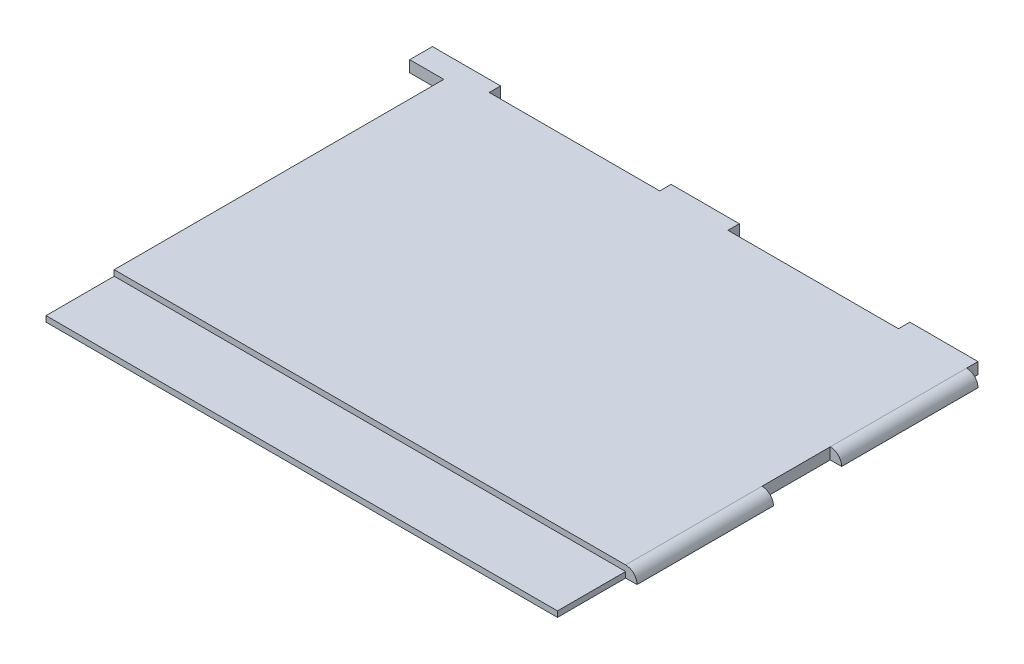
ISO-10303-21;
HEADER;
FILE_DESCRIPTION(('STEP AP214'),'2;1');
FILE_NAME('part.step','',(''),(''),'','','');
FILE_SCHEMA(('AUTOMOTIVE_DESIGN { 1 0 10303 214 1 1 1 1 }'));
ENDSEC;
DATA;
#1=APPLICATION_CONTEXT('core data for automotive mechanical design processes');
#2=APPLICATION_PROTOCOL_DEFINITION('international standard','automotive_design',2000,#1);
#3=PRODUCT_CONTEXT('',#1,'mechanical');
#4=PRODUCT('Part','Part','',(#3));
#5=PRODUCT_RELATED_PRODUCT_CATEGORY('part','',(#4));
#6=PRODUCT_DEFINITION_FORMATION('','',#4);
#7=PRODUCT_DEFINITION_CONTEXT('part definition',#1,'design');
#8=PRODUCT_DEFINITION('design','',#6,#7);
#9=PRODUCT_DEFINITION_SHAPE('','',#8);
#10=(LENGTH_UNIT() NAMED_UNIT(*) SI_UNIT(.MILLI.,.METRE.));
#11=(NAMED_UNIT(*) PLANE_ANGLE_UNIT() SI_UNIT($,.RADIAN.));
#12=(NAMED_UNIT(*) SI_UNIT($,.STERADIAN.) SOLID_ANGLE_UNIT());
#13=UNCERTAINTY_MEASURE_WITH_UNIT(LENGTH_MEASURE(1.E-05),#10,'distance_accuracy_value','');
#14=(GEOMETRIC_REPRESENTATION_CONTEXT(3) GLOBAL_UNCERTAINTY_ASSIGNED_CONTEXT((#13)) GLOBAL_UNIT_ASSIGNED_CONTEXT((#10,
#11,#12)) REPRESENTATION_CONTEXT('',''));
#15=CARTESIAN_POINT('',(0.,0.,0.));
#16=DIRECTION('',(0.,0.,1.));
#17=DIRECTION('',(1.,0.,0.));
#18=AXIS2_PLACEMENT_3D('',#15,#16,#17);
#19=CARTESIAN_POINT('',(203.746286717569,5.,0.));
#20=DIRECTION('',(1.,0.,0.));
#21=DIRECTION('',(0.,0.,-1.));
#22=AXIS2_PLACEMENT_3D('',#19,#20,#21);
#23=PLANE('',#22);
#24=DIRECTION('',(0.,0.,-1.));
#25=VECTOR('',#24,1.);
#26=CARTESIAN_POINT('',(203.746286717569,2.5,136.464902660625));
#27=LINE('',#26,#25);
#28=CARTESIAN_POINT('',(203.746286717569,2.5,136.464902660625));
#29=VERTEX_POINT('',#28);
#30=CARTESIAN_POINT('',(203.746286717569,2.5,106.464902660625));
#31=VERTEX_POINT('',#30);
#32=EDGE_CURVE('E596',#29,#31,#27,.T.);
#33=ORIENTED_EDGE('',*,*,#32,.F.);
#34=DIRECTION('',(0.,-1.,0.));
#35=VECTOR('',#34,1.);
#36=CARTESIAN_POINT('',(203.746286717569,5.,136.464902660625));
#37=LINE('',#36,#35);
#38=CARTESIAN_POINT('',(203.746286717569,0.,136.464902660625));
#39=VERTEX_POINT('',#38);
#40=EDGE_CURVE('E493',#29,#39,#37,.T.);
#41=ORIENTED_EDGE('',*,*,#40,.T.);
#42=DIRECTION('',(0.,0.,1.));
#43=VECTOR('',#42,1.);
#44=CARTESIAN_POINT('',(203.746286717569,0.,0.));
#45=LINE('',#44,#43);
#46=CARTESIAN_POINT('',(203.746286717569,0.,106.464902660625));
#47=VERTEX_POINT('',#46);
#48=EDGE_CURVE('E619',#47,#39,#45,.T.);
#49=ORIENTED_EDGE('',*,*,#48,.F.);
#50=DIRECTION('',(0.,1.,0.));
#51=VECTOR('',#50,1.);
#52=CARTESIAN_POINT('',(203.746286717569,5.,106.464902660625));
#53=LINE('',#52,#51);
#54=EDGE_CURVE('E474',#47,#31,#53,.T.);
#55=ORIENTED_EDGE('',*,*,#54,.T.);
#56=EDGE_LOOP('',(#33,#41,#49,#55));
#57=FACE_BOUND('',#56,.T.);
#58=ADVANCED_FACE('F403',(#57),#23,.T.);
#59=DIRECTION('',(0.,0.,1.));
#60=VECTOR('',#59,1.);
#61=CARTESIAN_POINT('',(203.746286717569,5.,0.));
#62=LINE('',#61,#60);
#63=CARTESIAN_POINT('',(203.746286717569,5.,16.4649026606249));
#64=VERTEX_POINT('',#63);
#65=CARTESIAN_POINT('',(203.746286717569,5.,46.4649026606249));
#66=VERTEX_POINT('',#65);
#67=EDGE_CURVE('E660',#64,#66,#62,.T.);
#68=ORIENTED_EDGE('',*,*,#67,.T.);
#69=DIRECTION('',(0.,-1.,0.));
#70=VECTOR('',#69,1.);
#71=CARTESIAN_POINT('',(203.746286717569,5.,46.4649026606249));
#72=LINE('',#71,#70);
#73=CARTESIAN_POINT('',(203.746286717569,0.,46.4649026606249));
#74=VERTEX_POINT('',#73);
#75=EDGE_CURVE('E490',#66,#74,#72,.T.);
#76=ORIENTED_EDGE('',*,*,#75,.T.);
#77=CARTESIAN_POINT('',(203.746286717569,0.,16.4649026606249));
#78=VERTEX_POINT('',#77);
#79=EDGE_CURVE('E694',#78,#74,#45,.T.);
#80=ORIENTED_EDGE('',*,*,#79,.F.);
#81=DIRECTION('',(0.,-1.,0.));
#82=VECTOR('',#81,1.);
#83=CARTESIAN_POINT('',(203.746286717569,5.,16.4649026606249));
#84=LINE('',#83,#82);
#85=EDGE_CURVE('E634',#64,#78,#84,.T.);
#86=ORIENTED_EDGE('',*,*,#85,.F.);
#87=EDGE_LOOP('',(#68,#76,#80,#86));
#88=FACE_BOUND('',#87,.T.);
#89=ADVANCED_FACE('F798',(#88),#23,.T.);
#90=CARTESIAN_POINT('',(0.,5.,16.4649026606249));
#91=DIRECTION('',(0.,0.,-1.));
#92=DIRECTION('',(-1.,0.,0.));
#93=AXIS2_PLACEMENT_3D('',#90,#91,#92);
#94=PLANE('',#93);
#95=DIRECTION('',(1.,0.,0.));
#96=VECTOR('',#95,1.);
#97=CARTESIAN_POINT('',(0.,0.,16.4649026606249));
#98=LINE('',#97,#96);
#99=CARTESIAN_POINT('',(208.746286717569,0.,16.4649026606249));
#100=VERTEX_POINT('',#99);
#101=EDGE_CURVE('E691',#78,#100,#98,.T.);
#102=ORIENTED_EDGE('',*,*,#101,.T.);
#103=CARTESIAN_POINT('',(203.746286717569,0.,16.4649026606249));
#104=DIRECTION('',(0.,0.,-1.));
#105=DIRECTION('',(-1.,0.,0.));
#106=AXIS2_PLACEMENT_3D('',#103,#104,#105);
#107=CIRCLE('',#106,5.);
#108=EDGE_CURVE('E494',#100,#64,#107,.F.);
#109=ORIENTED_EDGE('',*,*,#108,.T.);
#110=ORIENTED_EDGE('',*,*,#85,.T.);
#111=EDGE_LOOP('',(#102,#109,#110));
#112=FACE_BOUND('',#111,.T.);
#113=ADVANCED_FACE('F795',(#112),#94,.F.);
#114=CARTESIAN_POINT('',(0.,5.,-43.5350973393751));
#115=DIRECTION('',(0.,0.,-1.));
#116=DIRECTION('',(-1.,0.,0.));
#117=AXIS2_PLACEMENT_3D('',#114,#115,#116);
#118=PLANE('',#117);
#119=DIRECTION('',(0.,-1.,0.));
#120=VECTOR('',#119,1.);
#121=CARTESIAN_POINT('',(203.746286717569,5.,-43.5350973393751));
#122=LINE('',#121,#120);
#123=CARTESIAN_POINT('',(203.746286717569,5.,-43.5350973393751));
#124=VERTEX_POINT('',#123);
#125=CARTESIAN_POINT('',(203.746286717569,0.,-43.5350973393751));
#126=VERTEX_POINT('',#125);
#127=EDGE_CURVE('E636',#124,#126,#122,.T.);
#128=ORIENTED_EDGE('',*,*,#127,.F.);
#129=CARTESIAN_POINT('',(203.746286717569,0.,-43.5350973393751));
#130=DIRECTION('',(0.,0.,-1.));
#131=DIRECTION('',(-1.,0.,0.));
#132=AXIS2_PLACEMENT_3D('',#129,#130,#131);
#133=CIRCLE('',#132,5.);
#134=CARTESIAN_POINT('',(208.746286717569,0.,-43.5350973393751));
#135=VERTEX_POINT('',#134);
#136=EDGE_CURVE('E465',#124,#135,#133,.T.);
#137=ORIENTED_EDGE('',*,*,#136,.T.);
#138=DIRECTION('',(1.,0.,0.));
#139=VECTOR('',#138,1.);
#140=CARTESIAN_POINT('',(0.,0.,-43.5350973393751));
#141=LINE('',#140,#139);
#142=EDGE_CURVE('E685',#126,#135,#141,.T.);
#143=ORIENTED_EDGE('',*,*,#142,.F.);
#144=EDGE_LOOP('',(#128,#137,#143));
#145=FACE_BOUND('',#144,.T.);
#146=ADVANCED_FACE('F787',(#145),#118,.T.);
#147=CARTESIAN_POINT('',(203.746286717569,5.,0.));
#148=DIRECTION('',(-1.,0.,0.));
#149=DIRECTION('',(0.,0.,1.));
#150=AXIS2_PLACEMENT_3D('',#147,#148,#149);
#151=PLANE('',#150);
#152=DIRECTION('',(0.,0.,-1.));
#153=VECTOR('',#152,1.);
#154=CARTESIAN_POINT('',(203.746286717569,0.,0.));
#155=LINE('',#154,#153);
#156=CARTESIAN_POINT('',(203.746286717569,0.,-48.5350973393751));
#157=VERTEX_POINT('',#156);
#158=EDGE_CURVE('E683',#126,#157,#155,.T.);
#159=ORIENTED_EDGE('',*,*,#158,.T.);
#160=DIRECTION('',(0.,-1.,0.));
#161=VECTOR('',#160,1.);
#162=CARTESIAN_POINT('',(203.746286717569,5.,-48.5350973393751));
#163=LINE('',#162,#161);
#164=CARTESIAN_POINT('',(203.746286717569,5.,-48.5350973393751));
#165=VERTEX_POINT('',#164);
#166=EDGE_CURVE('E638',#165,#157,#163,.T.);
#167=ORIENTED_EDGE('',*,*,#166,.F.);
#168=DIRECTION('',(0.,0.,-1.));
#169=VECTOR('',#168,1.);
#170=CARTESIAN_POINT('',(203.746286717569,5.,0.));
#171=LINE('',#170,#169);
#172=EDGE_CURVE('E717',#124,#165,#171,.T.);
#173=ORIENTED_EDGE('',*,*,#172,.F.);
#174=ORIENTED_EDGE('',*,*,#127,.T.);
#175=EDGE_LOOP('',(#159,#167,#173,#174));
#176=FACE_BOUND('',#175,.T.);
#177=ADVANCED_FACE('F783',(#176),#151,.F.);
#178=CARTESIAN_POINT('',(0.,5.,-48.5350973393751));
#179=DIRECTION('',(0.,0.,1.));
#180=DIRECTION('',(1.,0.,0.));
#181=AXIS2_PLACEMENT_3D('',#178,#179,#180);
#182=PLANE('',#181);
#183=DIRECTION('',(-1.,0.,0.));
#184=VECTOR('',#183,1.);
#185=CARTESIAN_POINT('',(0.,0.,-48.5350973393751));
#186=LINE('',#185,#184);
#187=CARTESIAN_POINT('',(173.746286717569,0.,-48.5350973393751));
#188=VERTEX_POINT('',#187);
#189=EDGE_CURVE('E680',#157,#188,#186,.T.);
#190=ORIENTED_EDGE('',*,*,#189,.T.);
#191=DIRECTION('',(0.,-1.,0.));
#192=VECTOR('',#191,1.);
#193=CARTESIAN_POINT('',(173.746286717569,5.,-48.5350973393751));
#194=LINE('',#193,#192);
#195=CARTESIAN_POINT('',(173.746286717569,5.,-48.5350973393751));
#196=VERTEX_POINT('',#195);
#197=EDGE_CURVE('E641',#196,#188,#194,.T.);
#198=ORIENTED_EDGE('',*,*,#197,.F.);
#199=DIRECTION('',(-1.,0.,0.));
#200=VECTOR('',#199,1.);
#201=CARTESIAN_POINT('',(0.,5.,-48.5350973393751));
#202=LINE('',#201,#200);
#203=EDGE_CURVE('E715',#165,#196,#202,.T.);
#204=ORIENTED_EDGE('',*,*,#203,.F.);
#205=ORIENTED_EDGE('',*,*,#166,.T.);
#206=EDGE_LOOP('',(#190,#198,#204,#205));
#207=FACE_BOUND('',#206,.T.);
#208=ADVANCED_FACE('F778',(#207),#182,.F.);
#209=CARTESIAN_POINT('',(173.746286717569,5.,0.));
#210=DIRECTION('',(-1.,0.,0.));
#211=DIRECTION('',(0.,0.,1.));
#212=AXIS2_PLACEMENT_3D('',#209,#210,#211);
#213=PLANE('',#212);
#214=DIRECTION('',(0.,0.,-1.));
#215=VECTOR('',#214,1.);
#216=CARTESIAN_POINT('',(173.746286717569,0.,0.));
#217=LINE('',#216,#215);
#218=CARTESIAN_POINT('',(173.746286717569,0.,-43.5350973393751));
#219=VERTEX_POINT('',#218);
#220=EDGE_CURVE('E677',#219,#188,#217,.T.);
#221=ORIENTED_EDGE('',*,*,#220,.F.);
#222=DIRECTION('',(0.,-1.,0.));
#223=VECTOR('',#222,1.);
#224=CARTESIAN_POINT('',(173.746286717569,5.,-43.5350973393751));
#225=LINE('',#224,#223);
#226=CARTESIAN_POINT('',(173.746286717569,5.,-43.5350973393751));
#227=VERTEX_POINT('',#226);
#228=EDGE_CURVE('E643',#227,#219,#225,.T.);
#229=ORIENTED_EDGE('',*,*,#228,.F.);
#230=DIRECTION('',(0.,0.,-1.));
#231=VECTOR('',#230,1.);
#232=CARTESIAN_POINT('',(173.746286717569,5.,0.));
#233=LINE('',#232,#231);
#234=EDGE_CURVE('E712',#227,#196,#233,.T.);
#235=ORIENTED_EDGE('',*,*,#234,.T.);
#236=ORIENTED_EDGE('',*,*,#197,.T.);
#237=EDGE_LOOP('',(#221,#229,#235,#236));
#238=FACE_BOUND('',#237,.T.);
#239=ADVANCED_FACE('F772',(#238),#213,.T.);
#240=CARTESIAN_POINT('',(0.,5.,-43.5350973393751));
#241=DIRECTION('',(0.,0.,-1.));
#242=DIRECTION('',(-1.,0.,0.));
#243=AXIS2_PLACEMENT_3D('',#240,#241,#242);
#244=PLANE('',#243);
#245=DIRECTION('',(1.,0.,0.));
#246=VECTOR('',#245,1.);
#247=CARTESIAN_POINT('',(0.,0.,-43.5350973393751));
#248=LINE('',#247,#246);
#249=CARTESIAN_POINT('',(98.7462867175687,0.,-43.5350973393751));
#250=VERTEX_POINT('',#249);
#251=EDGE_CURVE('E676',#250,#219,#248,.T.);
#252=ORIENTED_EDGE('',*,*,#251,.F.);
#253=DIRECTION('',(0.,1.,0.));
#254=VECTOR('',#253,1.);
#255=CARTESIAN_POINT('',(98.7462867175687,5.,-43.5350973393751));
#256=LINE('',#255,#254);
#257=CARTESIAN_POINT('',(98.7462867175687,5.,-43.5350973393751));
#258=VERTEX_POINT('',#257);
#259=EDGE_CURVE('E426',#250,#258,#256,.T.);
#260=ORIENTED_EDGE('',*,*,#259,.T.);
#261=DIRECTION('',(1.,0.,0.));
#262=VECTOR('',#261,1.);
#263=CARTESIAN_POINT('',(0.,5.,-43.5350973393751));
#264=LINE('',#263,#262);
#265=EDGE_CURVE('E711',#258,#227,#264,.T.);
#266=ORIENTED_EDGE('',*,*,#265,.T.);
#267=ORIENTED_EDGE('',*,*,#228,.T.);
#268=EDGE_LOOP('',(#252,#260,#266,#267));
#269=FACE_BOUND('',#268,.T.);
#270=ADVANCED_FACE('F766',(#269),#244,.T.);
#271=DIRECTION('',(0.,1.,0.));
#272=VECTOR('',#271,1.);
#273=CARTESIAN_POINT('',(68.7462867175687,5.,-43.5350973393751));
#274=LINE('',#273,#272);
#275=CARTESIAN_POINT('',(68.7462867175687,0.,-43.5350973393751));
#276=VERTEX_POINT('',#275);
#277=CARTESIAN_POINT('',(68.7462867175687,5.,-43.5350973393751));
#278=VERTEX_POINT('',#277);
#279=EDGE_CURVE('E632',#276,#278,#274,.T.);
#280=ORIENTED_EDGE('',*,*,#279,.F.);
#281=CARTESIAN_POINT('',(-6.25371328243131,0.,-43.5350973393751));
#282=VERTEX_POINT('',#281);
#283=EDGE_CURVE('E673',#282,#276,#248,.T.);
#284=ORIENTED_EDGE('',*,*,#283,.F.);
#285=DIRECTION('',(0.,-1.,0.));
#286=VECTOR('',#285,1.);
#287=CARTESIAN_POINT('',(-6.25371328243131,5.,-43.5350973393751));
#288=LINE('',#287,#286);
#289=CARTESIAN_POINT('',(-6.25371328243131,5.,-43.5350973393751));
#290=VERTEX_POINT('',#289);
#291=EDGE_CURVE('E646',#290,#282,#288,.T.);
#292=ORIENTED_EDGE('',*,*,#291,.F.);
#293=EDGE_CURVE('E708',#290,#278,#264,.T.);
#294=ORIENTED_EDGE('',*,*,#293,.T.);
#295=EDGE_LOOP('',(#280,#284,#292,#294));
#296=FACE_BOUND('',#295,.T.);
#297=ADVANCED_FACE('F754',(#296),#244,.T.);
#298=CARTESIAN_POINT('',(-6.25371328243131,5.,0.));
#299=DIRECTION('',(-1.,0.,0.));
#300=DIRECTION('',(0.,0.,1.));
#301=AXIS2_PLACEMENT_3D('',#298,#299,#300);
#302=PLANE('',#301);
#303=DIRECTION('',(0.,0.,-1.));
#304=VECTOR('',#303,1.);
#305=CARTESIAN_POINT('',(-6.25371328243131,0.,0.));
#306=LINE('',#305,#304);
#307=CARTESIAN_POINT('',(-6.25371328243131,0.,-48.5350973393751));
#308=VERTEX_POINT('',#307);
#309=EDGE_CURVE('E670',#282,#308,#306,.T.);
#310=ORIENTED_EDGE('',*,*,#309,.T.);
#311=DIRECTION('',(0.,-1.,0.));
#312=VECTOR('',#311,1.);
#313=CARTESIAN_POINT('',(-6.25371328243131,5.,-48.5350973393751));
#314=LINE('',#313,#312);
#315=CARTESIAN_POINT('',(-6.25371328243131,5.,-48.5350973393751));
#316=VERTEX_POINT('',#315);
#317=EDGE_CURVE('E648',#316,#308,#314,.T.);
#318=ORIENTED_EDGE('',*,*,#317,.F.);
#319=DIRECTION('',(0.,0.,-1.));
#320=VECTOR('',#319,1.);
#321=CARTESIAN_POINT('',(-6.25371328243131,5.,0.));
#322=LINE('',#321,#320);
#323=EDGE_CURVE('E706',#290,#316,#322,.T.);
#324=ORIENTED_EDGE('',*,*,#323,.F.);
#325=ORIENTED_EDGE('',*,*,#291,.T.);
#326=EDGE_LOOP('',(#310,#318,#324,#325));
#327=FACE_BOUND('',#326,.T.);
#328=ADVANCED_FACE('F751',(#327),#302,.F.);
#329=CARTESIAN_POINT('',(0.,5.,-48.5350973393751));
#330=DIRECTION('',(0.,0.,-1.));
#331=DIRECTION('',(-1.,0.,0.));
#332=AXIS2_PLACEMENT_3D('',#329,#330,#331);
#333=PLANE('',#332);
#334=DIRECTION('',(1.,0.,0.));
#335=VECTOR('',#334,1.);
#336=CARTESIAN_POINT('',(0.,0.,-48.5350973393751));
#337=LINE('',#336,#335);
#338=CARTESIAN_POINT('',(-36.2537132824313,0.,-48.5350973393751));
#339=VERTEX_POINT('',#338);
#340=EDGE_CURVE('E667',#339,#308,#337,.T.);
#341=ORIENTED_EDGE('',*,*,#340,.F.);
#342=DIRECTION('',(0.,-1.,0.));
#343=VECTOR('',#342,1.);
#344=CARTESIAN_POINT('',(-36.2537132824313,5.,-48.5350973393751));
#345=LINE('',#344,#343);
#346=CARTESIAN_POINT('',(-36.2537132824313,5.,-48.5350973393751));
#347=VERTEX_POINT('',#346);
#348=EDGE_CURVE('E650',#347,#339,#345,.T.);
#349=ORIENTED_EDGE('',*,*,#348,.F.);
#350=DIRECTION('',(1.,0.,0.));
#351=VECTOR('',#350,1.);
#352=CARTESIAN_POINT('',(0.,5.,-48.5350973393751));
#353=LINE('',#352,#351);
#354=EDGE_CURVE('E703',#347,#316,#353,.T.);
#355=ORIENTED_EDGE('',*,*,#354,.T.);
#356=ORIENTED_EDGE('',*,*,#317,.T.);
#357=EDGE_LOOP('',(#341,#349,#355,#356));
#358=FACE_BOUND('',#357,.T.);
#359=ADVANCED_FACE('F746',(#358),#333,.T.);
#360=CARTESIAN_POINT('',(-36.2537132824313,5.,0.));
#361=DIRECTION('',(-1.,0.,0.));
#362=DIRECTION('',(0.,0.,1.));
#363=AXIS2_PLACEMENT_3D('',#360,#361,#362);
#364=PLANE('',#363);
#365=DIRECTION('',(0.,0.,-1.));
#366=VECTOR('',#365,1.);
#367=CARTESIAN_POINT('',(-36.2537132824313,0.,0.));
#368=LINE('',#367,#366);
#369=CARTESIAN_POINT('',(-36.2537132824313,0.,-38.5350973393751));
#370=VERTEX_POINT('',#369);
#371=EDGE_CURVE('E664',#370,#339,#368,.T.);
#372=ORIENTED_EDGE('',*,*,#371,.F.);
#373=DIRECTION('',(0.,-1.,0.));
#374=VECTOR('',#373,1.);
#375=CARTESIAN_POINT('',(-36.2537132824313,5.,-38.5350973393751));
#376=LINE('',#375,#374);
#377=CARTESIAN_POINT('',(-36.2537132824313,5.,-38.5350973393751));
#378=VERTEX_POINT('',#377);
#379=EDGE_CURVE('E652',#378,#370,#376,.T.);
#380=ORIENTED_EDGE('',*,*,#379,.F.);
#381=DIRECTION('',(0.,0.,-1.));
#382=VECTOR('',#381,1.);
#383=CARTESIAN_POINT('',(-36.2537132824313,5.,0.));
#384=LINE('',#383,#382);
#385=EDGE_CURVE('E700',#378,#347,#384,.T.);
#386=ORIENTED_EDGE('',*,*,#385,.T.);
#387=ORIENTED_EDGE('',*,*,#348,.T.);
#388=EDGE_LOOP('',(#372,#380,#386,#387));
#389=FACE_BOUND('',#388,.T.);
#390=ADVANCED_FACE('F741',(#389),#364,.T.);
#391=CARTESIAN_POINT('',(0.,5.,-38.5350973393751));
#392=DIRECTION('',(0.,0.,1.));
#393=DIRECTION('',(1.,0.,0.));
#394=AXIS2_PLACEMENT_3D('',#391,#392,#393);
#395=PLANE('',#394);
#396=DIRECTION('',(-1.,0.,0.));
#397=VECTOR('',#396,1.);
#398=CARTESIAN_POINT('',(0.,0.,-38.5350973393751));
#399=LINE('',#398,#397);
#400=CARTESIAN_POINT('',(-21.2537132824313,0.,-38.5350973393751));
#401=VERTEX_POINT('',#400);
#402=EDGE_CURVE('E661',#401,#370,#399,.T.);
#403=ORIENTED_EDGE('',*,*,#402,.F.);
#404=DIRECTION('',(0.,-1.,0.));
#405=VECTOR('',#404,1.);
#406=CARTESIAN_POINT('',(-21.2537132824313,5.,-38.5350973393751));
#407=LINE('',#406,#405);
#408=CARTESIAN_POINT('',(-21.2537132824313,5.,-38.5350973393751));
#409=VERTEX_POINT('',#408);
#410=EDGE_CURVE('E654',#409,#401,#407,.T.);
#411=ORIENTED_EDGE('',*,*,#410,.F.);
#412=DIRECTION('',(-1.,0.,0.));
#413=VECTOR('',#412,1.);
#414=CARTESIAN_POINT('',(0.,5.,-38.5350973393751));
#415=LINE('',#414,#413);
#416=EDGE_CURVE('E697',#409,#378,#415,.T.);
#417=ORIENTED_EDGE('',*,*,#416,.T.);
#418=ORIENTED_EDGE('',*,*,#379,.T.);
#419=EDGE_LOOP('',(#403,#411,#417,#418));
#420=FACE_BOUND('',#419,.T.);
#421=ADVANCED_FACE('F737',(#420),#395,.T.);
#422=CARTESIAN_POINT('',(-21.2537132824313,5.,0.));
#423=DIRECTION('',(-1.,0.,0.));
#424=DIRECTION('',(0.,0.,1.));
#425=AXIS2_PLACEMENT_3D('',#422,#423,#424);
#426=PLANE('',#425);
#427=DIRECTION('',(0.,-1.,0.));
#428=VECTOR('',#427,1.);
#429=CARTESIAN_POINT('',(-21.2537132824313,5.,106.464902660625));
#430=LINE('',#429,#428);
#431=CARTESIAN_POINT('',(-21.2537132824313,5.,106.464902660625));
#432=VERTEX_POINT('',#431);
#433=CARTESIAN_POINT('',(-21.2537132824313,2.5,106.464902660625));
#434=VERTEX_POINT('',#433);
#435=EDGE_CURVE('E722',#432,#434,#430,.T.);
#436=ORIENTED_EDGE('',*,*,#435,.F.);
#437=DIRECTION('',(0.,0.,-1.));
#438=VECTOR('',#437,1.);
#439=CARTESIAN_POINT('',(-21.2537132824313,5.,0.));
#440=LINE('',#439,#438);
#441=EDGE_CURVE('E657',#432,#409,#440,.T.);
#442=ORIENTED_EDGE('',*,*,#441,.T.);
#443=ORIENTED_EDGE('',*,*,#410,.T.);
#444=DIRECTION('',(0.,0.,-1.));
#445=VECTOR('',#444,1.);
#446=CARTESIAN_POINT('',(-21.2537132824313,0.,0.));
#447=LINE('',#446,#445);
#448=CARTESIAN_POINT('',(-21.2537132824313,0.,136.464902660625));
#449=VERTEX_POINT('',#448);
#450=EDGE_CURVE('E658',#449,#401,#447,.T.);
#451=ORIENTED_EDGE('',*,*,#450,.F.);
#452=DIRECTION('',(0.,-1.,0.));
#453=VECTOR('',#452,1.);
#454=CARTESIAN_POINT('',(-21.2537132824313,5.,136.464902660625));
#455=LINE('',#454,#453);
#456=CARTESIAN_POINT('',(-21.2537132824313,2.5,136.464902660625));
#457=VERTEX_POINT('',#456);
#458=EDGE_CURVE('E486',#457,#449,#455,.T.);
#459=ORIENTED_EDGE('',*,*,#458,.F.);
#460=DIRECTION('',(0.,0.,1.));
#461=VECTOR('',#460,1.);
#462=CARTESIAN_POINT('',(-21.2537132824313,2.5,0.));
#463=LINE('',#462,#461);
#464=EDGE_CURVE('E418',#434,#457,#463,.T.);
#465=ORIENTED_EDGE('',*,*,#464,.F.);
#466=EDGE_LOOP('',(#436,#442,#443,#451,#459,#465));
#467=FACE_BOUND('',#466,.T.);
#468=ADVANCED_FACE('F732',(#467),#426,.T.);
#469=CARTESIAN_POINT('',(0.,0.,0.));
#470=DIRECTION('',(0.,1.,0.));
#471=DIRECTION('',(0.,0.,1.));
#472=AXIS2_PLACEMENT_3D('',#469,#470,#471);
#473=PLANE('',#472);
#474=ORIENTED_EDGE('',*,*,#48,.T.);
#475=DIRECTION('',(-1.,0.,0.));
#476=VECTOR('',#475,1.);
#477=CARTESIAN_POINT('',(208.746286717569,0.,136.464902660625));
#478=LINE('',#477,#476);
#479=EDGE_CURVE('E606',#39,#449,#478,.T.);
#480=ORIENTED_EDGE('',*,*,#479,.T.);
#481=ORIENTED_EDGE('',*,*,#450,.T.);
#482=ORIENTED_EDGE('',*,*,#402,.T.);
#483=ORIENTED_EDGE('',*,*,#371,.T.);
#484=ORIENTED_EDGE('',*,*,#340,.T.);
#485=ORIENTED_EDGE('',*,*,#309,.F.);
#486=ORIENTED_EDGE('',*,*,#283,.T.);
#487=DIRECTION('',(0.,0.,-1.));
#488=VECTOR('',#487,1.);
#489=CARTESIAN_POINT('',(68.7462867175687,0.,-43.5350973393751));
#490=LINE('',#489,#488);
#491=CARTESIAN_POINT('',(68.7462867175687,0.,-48.5350973393751));
#492=VERTEX_POINT('',#491);
#493=EDGE_CURVE('E478',#276,#492,#490,.T.);
#494=ORIENTED_EDGE('',*,*,#493,.T.);
#495=DIRECTION('',(1.,0.,0.));
#496=VECTOR('',#495,1.);
#497=CARTESIAN_POINT('',(83.7462867175687,0.,-48.5350973393751));
#498=LINE('',#497,#496);
#499=CARTESIAN_POINT('',(98.7462867175687,0.,-48.5350973393751));
#500=VERTEX_POINT('',#499);
#501=EDGE_CURVE('E621',#492,#500,#498,.T.);
#502=ORIENTED_EDGE('',*,*,#501,.T.);
#503=DIRECTION('',(0.,0.,-1.));
#504=VECTOR('',#503,1.);
#505=CARTESIAN_POINT('',(98.7462867175687,0.,-43.5350973393751));
#506=LINE('',#505,#504);
#507=EDGE_CURVE('E611',#250,#500,#506,.T.);
#508=ORIENTED_EDGE('',*,*,#507,.F.);
#509=ORIENTED_EDGE('',*,*,#251,.T.);
#510=ORIENTED_EDGE('',*,*,#220,.T.);
#511=ORIENTED_EDGE('',*,*,#189,.F.);
#512=ORIENTED_EDGE('',*,*,#158,.F.);
#513=ORIENTED_EDGE('',*,*,#142,.T.);
#514=DIRECTION('',(0.,0.,1.));
#515=VECTOR('',#514,1.);
#516=CARTESIAN_POINT('',(208.746286717569,0.,0.));
#517=LINE('',#516,#515);
#518=EDGE_CURVE('E688',#135,#100,#517,.T.);
#519=ORIENTED_EDGE('',*,*,#518,.T.);
#520=ORIENTED_EDGE('',*,*,#101,.F.);
#521=ORIENTED_EDGE('',*,*,#79,.T.);
#522=DIRECTION('',(1.,0.,0.));
#523=VECTOR('',#522,1.);
#524=CARTESIAN_POINT('',(203.746286717569,0.,46.4649026606249));
#525=LINE('',#524,#523);
#526=CARTESIAN_POINT('',(208.746286717569,0.,46.4649026606249));
#527=VERTEX_POINT('',#526);
#528=EDGE_CURVE('E484',#74,#527,#525,.T.);
#529=ORIENTED_EDGE('',*,*,#528,.T.);
#530=DIRECTION('',(0.,0.,1.));
#531=VECTOR('',#530,1.);
#532=CARTESIAN_POINT('',(208.746286717569,0.,46.4649026606249));
#533=LINE('',#532,#531);
#534=CARTESIAN_POINT('',(208.746286717569,0.,106.464902660625));
#535=VERTEX_POINT('',#534);
#536=EDGE_CURVE('E459',#527,#535,#533,.T.);
#537=ORIENTED_EDGE('',*,*,#536,.T.);
#538=DIRECTION('',(1.,0.,0.));
#539=VECTOR('',#538,1.);
#540=CARTESIAN_POINT('',(203.746286717569,0.,106.464902660625));
#541=LINE('',#540,#539);
#542=EDGE_CURVE('E469',#47,#535,#541,.T.);
#543=ORIENTED_EDGE('',*,*,#542,.F.);
#544=EDGE_LOOP('',(#474,#480,#481,#482,#483,#484,#485,#486,#494,#502,#508,#509,#510,#511,#512,
#513,#519,#520,#521,#529,#537,#543));
#545=FACE_BOUND('',#544,.T.);
#546=ADVANCED_FACE('F481',(#545),#473,.F.);
#547=CARTESIAN_POINT('',(0.,5.,0.));
#548=DIRECTION('',(0.,1.,0.));
#549=DIRECTION('',(0.,0.,1.));
#550=AXIS2_PLACEMENT_3D('',#547,#548,#549);
#551=PLANE('',#550);
#552=DIRECTION('',(1.,0.,0.));
#553=VECTOR('',#552,1.);
#554=CARTESIAN_POINT('',(-36.2537132824313,5.,106.464902660625));
#555=LINE('',#554,#553);
#556=CARTESIAN_POINT('',(203.746286717569,5.,106.464902660625));
#557=VERTEX_POINT('',#556);
#558=EDGE_CURVE('E725',#432,#557,#555,.T.);
#559=ORIENTED_EDGE('',*,*,#558,.T.);
#560=DIRECTION('',(0.,0.,1.));
#561=VECTOR('',#560,1.);
#562=CARTESIAN_POINT('',(203.746286717569,5.,0.));
#563=LINE('',#562,#561);
#564=EDGE_CURVE('E462',#557,#66,#563,.F.);
#565=ORIENTED_EDGE('',*,*,#564,.T.);
#566=ORIENTED_EDGE('',*,*,#67,.F.);
#567=DIRECTION('',(0.,0.,1.));
#568=VECTOR('',#567,1.);
#569=CARTESIAN_POINT('',(203.746286717569,5.,0.));
#570=LINE('',#569,#568);
#571=EDGE_CURVE('E498',#64,#124,#570,.F.);
#572=ORIENTED_EDGE('',*,*,#571,.T.);
#573=ORIENTED_EDGE('',*,*,#172,.T.);
#574=ORIENTED_EDGE('',*,*,#203,.T.);
#575=ORIENTED_EDGE('',*,*,#234,.F.);
#576=ORIENTED_EDGE('',*,*,#265,.F.);
#577=DIRECTION('',(0.,0.,-1.));
#578=VECTOR('',#577,1.);
#579=CARTESIAN_POINT('',(98.7462867175687,5.,-43.5350973393751));
#580=LINE('',#579,#578);
#581=CARTESIAN_POINT('',(98.7462867175687,5.,-48.5350973393751));
#582=VERTEX_POINT('',#581);
#583=EDGE_CURVE('E624',#258,#582,#580,.T.);
#584=ORIENTED_EDGE('',*,*,#583,.T.);
#585=DIRECTION('',(1.,0.,0.));
#586=VECTOR('',#585,1.);
#587=CARTESIAN_POINT('',(83.7462867175687,5.,-48.5350973393751));
#588=LINE('',#587,#586);
#589=CARTESIAN_POINT('',(68.7462867175687,5.,-48.5350973393751));
#590=VERTEX_POINT('',#589);
#591=EDGE_CURVE('E620',#590,#582,#588,.T.);
#592=ORIENTED_EDGE('',*,*,#591,.F.);
#593=DIRECTION('',(0.,0.,-1.));
#594=VECTOR('',#593,1.);
#595=CARTESIAN_POINT('',(68.7462867175687,5.,-43.5350973393751));
#596=LINE('',#595,#594);
#597=EDGE_CURVE('E612',#278,#590,#596,.T.);
#598=ORIENTED_EDGE('',*,*,#597,.F.);
#599=ORIENTED_EDGE('',*,*,#293,.F.);
#600=ORIENTED_EDGE('',*,*,#323,.T.);
#601=ORIENTED_EDGE('',*,*,#354,.F.);
#602=ORIENTED_EDGE('',*,*,#385,.F.);
#603=ORIENTED_EDGE('',*,*,#416,.F.);
#604=ORIENTED_EDGE('',*,*,#441,.F.);
#605=EDGE_LOOP('',(#559,#565,#566,#572,#573,#574,#575,#576,#584,#592,#598,#599,#600,#601,#602,
#603,#604));
#606=FACE_BOUND('',#605,.T.);
#607=ADVANCED_FACE('F728',(#606),#551,.T.);
#608=CARTESIAN_POINT('',(203.746286717569,5.,106.464902660625));
#609=DIRECTION('',(0.,0.,-1.));
#610=DIRECTION('',(-1.,0.,0.));
#611=AXIS2_PLACEMENT_3D('',#608,#609,#610);
#612=PLANE('',#611);
#613=ORIENTED_EDGE('',*,*,#542,.T.);
#614=CARTESIAN_POINT('',(203.746286717569,0.,106.464902660625));
#615=DIRECTION('',(0.,0.,-1.));
#616=DIRECTION('',(-1.,0.,0.));
#617=AXIS2_PLACEMENT_3D('',#614,#615,#616);
#618=CIRCLE('',#617,5.);
#619=EDGE_CURVE('E455',#535,#557,#618,.F.);
#620=ORIENTED_EDGE('',*,*,#619,.T.);
#621=ORIENTED_EDGE('',*,*,#558,.F.);
#622=ORIENTED_EDGE('',*,*,#435,.T.);
#623=DIRECTION('',(1.,0.,0.));
#624=VECTOR('',#623,1.);
#625=CARTESIAN_POINT('',(-36.2537132824313,2.5,106.464902660625));
#626=LINE('',#625,#624);
#627=EDGE_CURVE('E602',#434,#31,#626,.T.);
#628=ORIENTED_EDGE('',*,*,#627,.T.);
#629=ORIENTED_EDGE('',*,*,#54,.F.);
#630=EDGE_LOOP('',(#613,#620,#621,#622,#628,#629));
#631=FACE_BOUND('',#630,.T.);
#632=ADVANCED_FACE('F470',(#631),#612,.F.);
#633=CARTESIAN_POINT('',(203.746286717569,5.,46.4649026606249));
#634=DIRECTION('',(0.,0.,-1.));
#635=DIRECTION('',(-1.,0.,0.));
#636=AXIS2_PLACEMENT_3D('',#633,#634,#635);
#637=PLANE('',#636);
#638=ORIENTED_EDGE('',*,*,#75,.F.);
#639=CARTESIAN_POINT('',(203.746286717569,0.,46.4649026606249));
#640=DIRECTION('',(0.,0.,-1.));
#641=DIRECTION('',(-1.,0.,0.));
#642=AXIS2_PLACEMENT_3D('',#639,#640,#641);
#643=CIRCLE('',#642,5.);
#644=EDGE_CURVE('E411',#66,#527,#643,.T.);
#645=ORIENTED_EDGE('',*,*,#644,.T.);
#646=ORIENTED_EDGE('',*,*,#528,.F.);
#647=EDGE_LOOP('',(#638,#645,#646));
#648=FACE_BOUND('',#647,.T.);
#649=ADVANCED_FACE('F504',(#648),#637,.T.);
#650=CARTESIAN_POINT('',(98.7462867175687,5.,-43.5350973393751));
#651=DIRECTION('',(-1.,0.,0.));
#652=DIRECTION('',(0.,0.,1.));
#653=AXIS2_PLACEMENT_3D('',#650,#651,#652);
#654=PLANE('',#653);
#655=ORIENTED_EDGE('',*,*,#507,.T.);
#656=DIRECTION('',(0.,-1.,0.));
#657=VECTOR('',#656,1.);
#658=CARTESIAN_POINT('',(98.7462867175687,5.,-48.5350973393751));
#659=LINE('',#658,#657);
#660=EDGE_CURVE('E617',#582,#500,#659,.T.);
#661=ORIENTED_EDGE('',*,*,#660,.F.);
#662=ORIENTED_EDGE('',*,*,#583,.F.);
#663=ORIENTED_EDGE('',*,*,#259,.F.);
#664=EDGE_LOOP('',(#655,#661,#662,#663));
#665=FACE_BOUND('',#664,.T.);
#666=ADVANCED_FACE('F765',(#665),#654,.F.);
#667=CARTESIAN_POINT('',(83.7462867175687,5.,-48.5350973393751));
#668=DIRECTION('',(0.,0.,-1.));
#669=DIRECTION('',(-1.,0.,0.));
#670=AXIS2_PLACEMENT_3D('',#667,#668,#669);
#671=PLANE('',#670);
#672=ORIENTED_EDGE('',*,*,#501,.F.);
#673=DIRECTION('',(0.,-1.,0.));
#674=VECTOR('',#673,1.);
#675=CARTESIAN_POINT('',(68.7462867175687,5.,-48.5350973393751));
#676=LINE('',#675,#674);
#677=EDGE_CURVE('E608',#590,#492,#676,.T.);
#678=ORIENTED_EDGE('',*,*,#677,.F.);
#679=ORIENTED_EDGE('',*,*,#591,.T.);
#680=ORIENTED_EDGE('',*,*,#660,.T.);
#681=EDGE_LOOP('',(#672,#678,#679,#680));
#682=FACE_BOUND('',#681,.T.);
#683=ADVANCED_FACE('F762',(#682),#671,.T.);
#684=CARTESIAN_POINT('',(68.7462867175687,5.,-43.5350973393751));
#685=DIRECTION('',(-1.,0.,0.));
#686=DIRECTION('',(0.,0.,1.));
#687=AXIS2_PLACEMENT_3D('',#684,#685,#686);
#688=PLANE('',#687);
#689=ORIENTED_EDGE('',*,*,#493,.F.);
#690=ORIENTED_EDGE('',*,*,#279,.T.);
#691=ORIENTED_EDGE('',*,*,#597,.T.);
#692=ORIENTED_EDGE('',*,*,#677,.T.);
#693=EDGE_LOOP('',(#689,#690,#691,#692));
#694=FACE_BOUND('',#693,.T.);
#695=ADVANCED_FACE('F758',(#694),#688,.T.);
#696=CARTESIAN_POINT('',(203.746286717569,0.,0.));
#697=DIRECTION('',(0.,0.,1.));
#698=DIRECTION('',(1.,0.,0.));
#699=AXIS2_PLACEMENT_3D('',#696,#697,#698);
#700=CYLINDRICAL_SURFACE('',#699,5.);
#701=ORIENTED_EDGE('',*,*,#136,.F.);
#702=ORIENTED_EDGE('',*,*,#571,.F.);
#703=ORIENTED_EDGE('',*,*,#108,.F.);
#704=ORIENTED_EDGE('',*,*,#518,.F.);
#705=EDGE_LOOP('',(#701,#702,#703,#704));
#706=FACE_BOUND('',#705,.T.);
#707=ADVANCED_FACE('F791',(#706),#700,.T.);
#708=CARTESIAN_POINT('',(203.746286717569,0.,46.4649026606249));
#709=DIRECTION('',(0.,0.,1.));
#710=DIRECTION('',(1.,0.,0.));
#711=AXIS2_PLACEMENT_3D('',#708,#709,#710);
#712=CYLINDRICAL_SURFACE('',#711,5.);
#713=ORIENTED_EDGE('',*,*,#644,.F.);
#714=ORIENTED_EDGE('',*,*,#564,.F.);
#715=ORIENTED_EDGE('',*,*,#619,.F.);
#716=ORIENTED_EDGE('',*,*,#536,.F.);
#717=EDGE_LOOP('',(#713,#714,#715,#716));
#718=FACE_BOUND('',#717,.T.);
#719=ADVANCED_FACE('F405',(#718),#712,.T.);
#720=CARTESIAN_POINT('',(208.746286717569,0.,136.464902660625));
#721=DIRECTION('',(0.,0.,-1.));
#722=DIRECTION('',(-1.,0.,0.));
#723=AXIS2_PLACEMENT_3D('',#720,#721,#722);
#724=PLANE('',#723);
#725=ORIENTED_EDGE('',*,*,#40,.F.);
#726=DIRECTION('',(-1.,0.,0.));
#727=VECTOR('',#726,1.);
#728=CARTESIAN_POINT('',(208.746286717569,2.5,136.464902660625));
#729=LINE('',#728,#727);
#730=EDGE_CURVE('E12',#29,#457,#729,.T.);
#731=ORIENTED_EDGE('',*,*,#730,.T.);
#732=ORIENTED_EDGE('',*,*,#458,.T.);
#733=ORIENTED_EDGE('',*,*,#479,.F.);
#734=EDGE_LOOP('',(#725,#731,#732,#733));
#735=FACE_BOUND('',#734,.T.);
#736=ADVANCED_FACE('F604',(#735),#724,.F.);
#737=CARTESIAN_POINT('',(-36.2537132824313,2.5,136.464902660625));
#738=DIRECTION('',(0.,-1.,0.));
#739=DIRECTION('',(0.,0.,-1.));
#740=AXIS2_PLACEMENT_3D('',#737,#738,#739);
#741=PLANE('',#740);
#742=ORIENTED_EDGE('',*,*,#464,.T.);
#743=ORIENTED_EDGE('',*,*,#730,.F.);
#744=ORIENTED_EDGE('',*,*,#32,.T.);
#745=ORIENTED_EDGE('',*,*,#627,.F.);
#746=EDGE_LOOP('',(#742,#743,#744,#745));
#747=FACE_BOUND('',#746,.T.);
#748=ADVANCED_FACE('F595',(#747),#741,.F.);
#749=CLOSED_SHELL('',(#58,#89,#113,#146,#177,#208,#239,#270,#297,#328,#359,#390,#421,#468,#546,
#607,#632,#649,#666,#683,#695,#707,#719,#736,#748));
#750=MANIFOLD_SOLID_BREP('B2',#749);
#751=ADVANCED_BREP_SHAPE_REPRESENTATION('',(#18,#750),#14);
#752=SHAPE_DEFINITION_REPRESENTATION(#9,#751);
ENDSEC;
END-ISO-10303-21;
